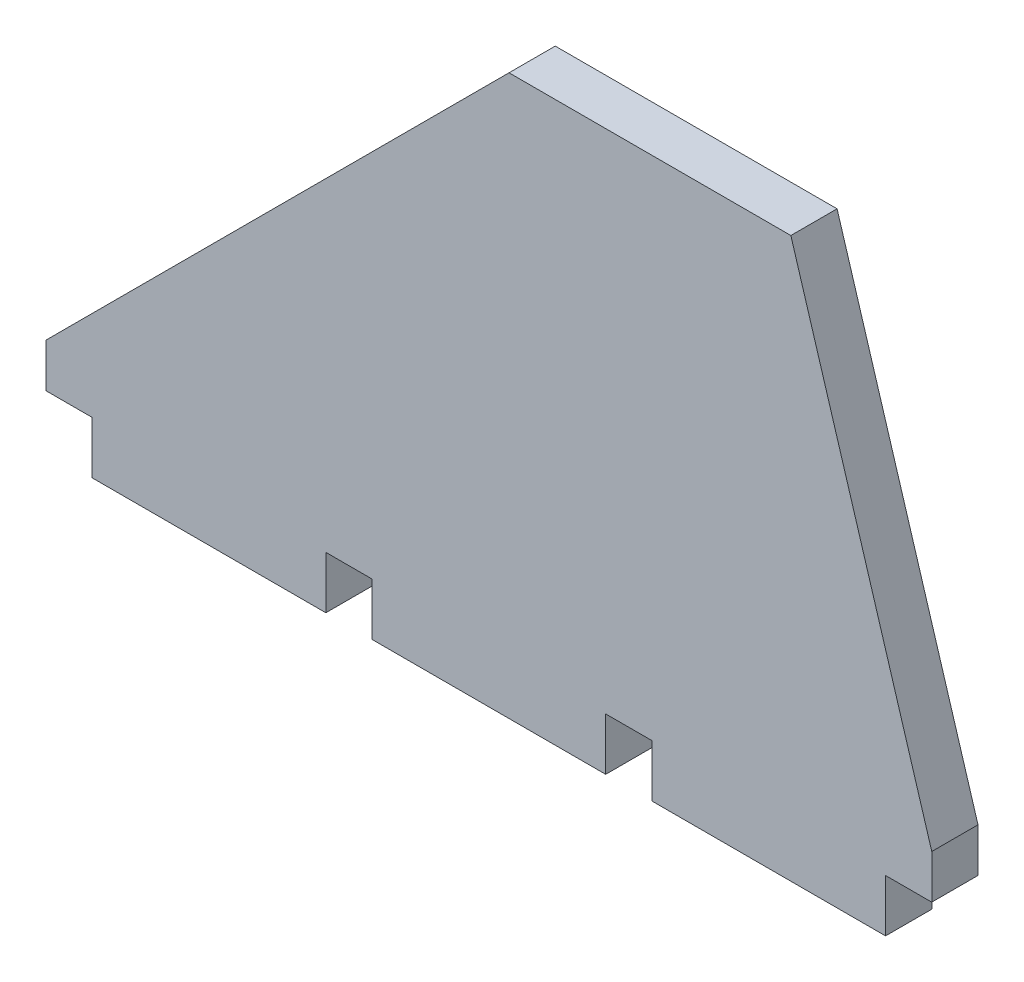
ISO-10303-21;
HEADER;
FILE_DESCRIPTION(('STEP AP214'),'2;1');
FILE_NAME('part.step','',(''),(''),'','','');
FILE_SCHEMA(('AUTOMOTIVE_DESIGN { 1 0 10303 214 1 1 1 1 }'));
ENDSEC;
DATA;
#1=APPLICATION_CONTEXT('core data for automotive mechanical design processes');
#2=APPLICATION_PROTOCOL_DEFINITION('international standard','automotive_design',2000,#1);
#3=PRODUCT_CONTEXT('',#1,'mechanical');
#4=PRODUCT('Part','Part','',(#3));
#5=PRODUCT_RELATED_PRODUCT_CATEGORY('part','',(#4));
#6=PRODUCT_DEFINITION_FORMATION('','',#4);
#7=PRODUCT_DEFINITION_CONTEXT('part definition',#1,'design');
#8=PRODUCT_DEFINITION('design','',#6,#7);
#9=PRODUCT_DEFINITION_SHAPE('','',#8);
#10=(LENGTH_UNIT() NAMED_UNIT(*) SI_UNIT(.MILLI.,.METRE.));
#11=(NAMED_UNIT(*) PLANE_ANGLE_UNIT() SI_UNIT($,.RADIAN.));
#12=(NAMED_UNIT(*) SI_UNIT($,.STERADIAN.) SOLID_ANGLE_UNIT());
#13=UNCERTAINTY_MEASURE_WITH_UNIT(LENGTH_MEASURE(1.E-05),#10,'distance_accuracy_value','');
#14=(GEOMETRIC_REPRESENTATION_CONTEXT(3) GLOBAL_UNCERTAINTY_ASSIGNED_CONTEXT((#13)) GLOBAL_UNIT_ASSIGNED_CONTEXT((#10,
#11,#12)) REPRESENTATION_CONTEXT('',''));
#15=CARTESIAN_POINT('',(0.,0.,0.));
#16=DIRECTION('',(0.,0.,1.));
#17=DIRECTION('',(1.,0.,0.));
#18=AXIS2_PLACEMENT_3D('',#15,#16,#17);
#19=CARTESIAN_POINT('',(0.,10.9,11.482));
#20=DIRECTION('',(1.,0.,0.));
#21=DIRECTION('',(0.,0.,-1.));
#22=AXIS2_PLACEMENT_3D('',#19,#20,#21);
#23=PLANE('',#22);
#24=DIRECTION('',(0.,-1.,0.));
#25=VECTOR('',#24,1.);
#26=CARTESIAN_POINT('',(0.,10.9,0.));
#27=LINE('',#26,#25);
#28=CARTESIAN_POINT('',(0.,10.9,0.));
#29=VERTEX_POINT('',#28);
#30=CARTESIAN_POINT('',(0.,0.,0.));
#31=VERTEX_POINT('',#30);
#32=EDGE_CURVE('E190',#29,#31,#27,.T.);
#33=ORIENTED_EDGE('',*,*,#32,.T.);
#34=DIRECTION('',(0.,0.,-1.));
#35=VECTOR('',#34,1.);
#36=CARTESIAN_POINT('',(0.,0.,11.482));
#37=LINE('',#36,#35);
#38=CARTESIAN_POINT('',(0.,0.,11.482));
#39=VERTEX_POINT('',#38);
#40=EDGE_CURVE('E11',#39,#31,#37,.T.);
#41=ORIENTED_EDGE('',*,*,#40,.F.);
#42=DIRECTION('',(0.,-1.,0.));
#43=VECTOR('',#42,1.);
#44=CARTESIAN_POINT('',(0.,10.9,11.482));
#45=LINE('',#44,#43);
#46=CARTESIAN_POINT('',(0.,10.9,11.482));
#47=VERTEX_POINT('',#46);
#48=EDGE_CURVE('E224',#47,#39,#45,.T.);
#49=ORIENTED_EDGE('',*,*,#48,.F.);
#50=DIRECTION('',(0.,0.,-1.));
#51=VECTOR('',#50,1.);
#52=CARTESIAN_POINT('',(0.,10.9,11.482));
#53=LINE('',#52,#51);
#54=EDGE_CURVE('E186',#47,#29,#53,.T.);
#55=ORIENTED_EDGE('',*,*,#54,.T.);
#56=EDGE_LOOP('',(#33,#41,#49,#55));
#57=FACE_BOUND('',#56,.T.);
#58=ADVANCED_FACE('F34',(#57),#23,.F.);
#59=CARTESIAN_POINT('',(0.,0.,11.482));
#60=DIRECTION('',(0.,1.,0.));
#61=DIRECTION('',(0.,0.,1.));
#62=AXIS2_PLACEMENT_3D('',#59,#60,#61);
#63=PLANE('',#62);
#64=DIRECTION('',(1.,0.,0.));
#65=VECTOR('',#64,1.);
#66=CARTESIAN_POINT('',(0.,0.,0.));
#67=LINE('',#66,#65);
#68=CARTESIAN_POINT('',(11.482,0.,0.));
#69=VERTEX_POINT('',#68);
#70=EDGE_CURVE('E193',#31,#69,#67,.T.);
#71=ORIENTED_EDGE('',*,*,#70,.T.);
#72=DIRECTION('',(0.,0.,-1.));
#73=VECTOR('',#72,1.);
#74=CARTESIAN_POINT('',(11.482,0.,11.482));
#75=LINE('',#74,#73);
#76=CARTESIAN_POINT('',(11.482,0.,11.482));
#77=VERTEX_POINT('',#76);
#78=EDGE_CURVE('E42',#77,#69,#75,.T.);
#79=ORIENTED_EDGE('',*,*,#78,.F.);
#80=DIRECTION('',(1.,0.,0.));
#81=VECTOR('',#80,1.);
#82=CARTESIAN_POINT('',(0.,0.,11.482));
#83=LINE('',#82,#81);
#84=EDGE_CURVE('E123',#39,#77,#83,.T.);
#85=ORIENTED_EDGE('',*,*,#84,.F.);
#86=ORIENTED_EDGE('',*,*,#40,.T.);
#87=EDGE_LOOP('',(#71,#79,#85,#86));
#88=FACE_BOUND('',#87,.T.);
#89=ADVANCED_FACE('F332',(#88),#63,.F.);
#90=CARTESIAN_POINT('',(11.482,0.,11.482));
#91=DIRECTION('',(1.,0.,0.));
#92=DIRECTION('',(0.,0.,-1.));
#93=AXIS2_PLACEMENT_3D('',#90,#91,#92);
#94=PLANE('',#93);
#95=DIRECTION('',(0.,-1.,0.));
#96=VECTOR('',#95,1.);
#97=CARTESIAN_POINT('',(11.482,0.,0.));
#98=LINE('',#97,#96);
#99=CARTESIAN_POINT('',(11.482,-13.,0.));
#100=VERTEX_POINT('',#99);
#101=EDGE_CURVE('E195',#69,#100,#98,.T.);
#102=ORIENTED_EDGE('',*,*,#101,.T.);
#103=DIRECTION('',(0.,0.,-1.));
#104=VECTOR('',#103,1.);
#105=CARTESIAN_POINT('',(11.482,-13.,11.482));
#106=LINE('',#105,#104);
#107=CARTESIAN_POINT('',(11.482,-13.,11.482));
#108=VERTEX_POINT('',#107);
#109=EDGE_CURVE('E261',#108,#100,#106,.T.);
#110=ORIENTED_EDGE('',*,*,#109,.F.);
#111=DIRECTION('',(0.,-1.,0.));
#112=VECTOR('',#111,1.);
#113=CARTESIAN_POINT('',(11.482,0.,11.482));
#114=LINE('',#113,#112);
#115=EDGE_CURVE('E269',#77,#108,#114,.T.);
#116=ORIENTED_EDGE('',*,*,#115,.F.);
#117=ORIENTED_EDGE('',*,*,#78,.T.);
#118=EDGE_LOOP('',(#102,#110,#116,#117));
#119=FACE_BOUND('',#118,.T.);
#120=ADVANCED_FACE('F267',(#119),#94,.F.);
#121=CARTESIAN_POINT('',(11.482,-13.,11.482));
#122=DIRECTION('',(0.,1.,0.));
#123=DIRECTION('',(0.,0.,1.));
#124=AXIS2_PLACEMENT_3D('',#121,#122,#123);
#125=PLANE('',#124);
#126=DIRECTION('',(1.,0.,0.));
#127=VECTOR('',#126,1.);
#128=CARTESIAN_POINT('',(11.482,-13.,0.));
#129=LINE('',#128,#127);
#130=CARTESIAN_POINT('',(69.506,-13.,0.));
#131=VERTEX_POINT('',#130);
#132=EDGE_CURVE('E197',#100,#131,#129,.T.);
#133=ORIENTED_EDGE('',*,*,#132,.T.);
#134=DIRECTION('',(0.,0.,-1.));
#135=VECTOR('',#134,1.);
#136=CARTESIAN_POINT('',(69.506,-13.,11.482));
#137=LINE('',#136,#135);
#138=CARTESIAN_POINT('',(69.506,-13.,11.482));
#139=VERTEX_POINT('',#138);
#140=EDGE_CURVE('E258',#139,#131,#137,.T.);
#141=ORIENTED_EDGE('',*,*,#140,.F.);
#142=DIRECTION('',(1.,0.,0.));
#143=VECTOR('',#142,1.);
#144=CARTESIAN_POINT('',(11.482,-13.,11.482));
#145=LINE('',#144,#143);
#146=EDGE_CURVE('E287',#108,#139,#145,.T.);
#147=ORIENTED_EDGE('',*,*,#146,.F.);
#148=ORIENTED_EDGE('',*,*,#109,.T.);
#149=EDGE_LOOP('',(#133,#141,#147,#148));
#150=FACE_BOUND('',#149,.T.);
#151=ADVANCED_FACE('F278',(#150),#125,.F.);
#152=CARTESIAN_POINT('',(69.506,-13.,11.482));
#153=DIRECTION('',(-1.,0.,0.));
#154=DIRECTION('',(0.,-1.,0.));
#155=AXIS2_PLACEMENT_3D('',#152,#153,#154);
#156=PLANE('',#155);
#157=DIRECTION('',(0.,1.,0.));
#158=VECTOR('',#157,1.);
#159=CARTESIAN_POINT('',(69.506,-13.,0.));
#160=LINE('',#159,#158);
#161=CARTESIAN_POINT('',(69.506,0.,0.));
#162=VERTEX_POINT('',#161);
#163=EDGE_CURVE('E199',#131,#162,#160,.T.);
#164=ORIENTED_EDGE('',*,*,#163,.T.);
#165=DIRECTION('',(0.,0.,-1.));
#166=VECTOR('',#165,1.);
#167=CARTESIAN_POINT('',(69.506,0.,11.482));
#168=LINE('',#167,#166);
#169=CARTESIAN_POINT('',(69.506,0.,11.482));
#170=VERTEX_POINT('',#169);
#171=EDGE_CURVE('E255',#170,#162,#168,.T.);
#172=ORIENTED_EDGE('',*,*,#171,.F.);
#173=DIRECTION('',(0.,1.,0.));
#174=VECTOR('',#173,1.);
#175=CARTESIAN_POINT('',(69.506,-13.,11.482));
#176=LINE('',#175,#174);
#177=EDGE_CURVE('E284',#139,#170,#176,.T.);
#178=ORIENTED_EDGE('',*,*,#177,.F.);
#179=ORIENTED_EDGE('',*,*,#140,.T.);
#180=EDGE_LOOP('',(#164,#172,#178,#179));
#181=FACE_BOUND('',#180,.T.);
#182=ADVANCED_FACE('F282',(#181),#156,.F.);
#183=CARTESIAN_POINT('',(69.506,0.,11.482));
#184=DIRECTION('',(0.,1.,0.));
#185=DIRECTION('',(0.,0.,1.));
#186=AXIS2_PLACEMENT_3D('',#183,#184,#185);
#187=PLANE('',#186);
#188=DIRECTION('',(1.,0.,0.));
#189=VECTOR('',#188,1.);
#190=CARTESIAN_POINT('',(69.506,0.,0.));
#191=LINE('',#190,#189);
#192=CARTESIAN_POINT('',(80.988,0.,0.));
#193=VERTEX_POINT('',#192);
#194=EDGE_CURVE('E201',#162,#193,#191,.T.);
#195=ORIENTED_EDGE('',*,*,#194,.T.);
#196=DIRECTION('',(0.,0.,-1.));
#197=VECTOR('',#196,1.);
#198=CARTESIAN_POINT('',(80.988,0.,11.482));
#199=LINE('',#198,#197);
#200=CARTESIAN_POINT('',(80.988,0.,11.482));
#201=VERTEX_POINT('',#200);
#202=EDGE_CURVE('E252',#201,#193,#199,.T.);
#203=ORIENTED_EDGE('',*,*,#202,.F.);
#204=DIRECTION('',(1.,0.,0.));
#205=VECTOR('',#204,1.);
#206=CARTESIAN_POINT('',(69.506,0.,11.482));
#207=LINE('',#206,#205);
#208=EDGE_CURVE('E286',#170,#201,#207,.T.);
#209=ORIENTED_EDGE('',*,*,#208,.F.);
#210=ORIENTED_EDGE('',*,*,#171,.T.);
#211=EDGE_LOOP('',(#195,#203,#209,#210));
#212=FACE_BOUND('',#211,.T.);
#213=ADVANCED_FACE('F345',(#212),#187,.F.);
#214=CARTESIAN_POINT('',(80.988,0.,11.482));
#215=DIRECTION('',(1.,0.,0.));
#216=DIRECTION('',(0.,1.,0.));
#217=AXIS2_PLACEMENT_3D('',#214,#215,#216);
#218=PLANE('',#217);
#219=DIRECTION('',(0.,-1.,0.));
#220=VECTOR('',#219,1.);
#221=CARTESIAN_POINT('',(80.988,0.,0.));
#222=LINE('',#221,#220);
#223=CARTESIAN_POINT('',(80.988,-13.,0.));
#224=VERTEX_POINT('',#223);
#225=EDGE_CURVE('E203',#193,#224,#222,.T.);
#226=ORIENTED_EDGE('',*,*,#225,.T.);
#227=DIRECTION('',(0.,0.,-1.));
#228=VECTOR('',#227,1.);
#229=CARTESIAN_POINT('',(80.988,-13.,11.482));
#230=LINE('',#229,#228);
#231=CARTESIAN_POINT('',(80.988,-13.,11.482));
#232=VERTEX_POINT('',#231);
#233=EDGE_CURVE('E249',#232,#224,#230,.T.);
#234=ORIENTED_EDGE('',*,*,#233,.F.);
#235=DIRECTION('',(0.,-1.,0.));
#236=VECTOR('',#235,1.);
#237=CARTESIAN_POINT('',(80.988,0.,11.482));
#238=LINE('',#237,#236);
#239=EDGE_CURVE('E289',#201,#232,#238,.T.);
#240=ORIENTED_EDGE('',*,*,#239,.F.);
#241=ORIENTED_EDGE('',*,*,#202,.T.);
#242=EDGE_LOOP('',(#226,#234,#240,#241));
#243=FACE_BOUND('',#242,.T.);
#244=ADVANCED_FACE('F348',(#243),#218,.F.);
#245=CARTESIAN_POINT('',(80.988,-13.,11.482));
#246=DIRECTION('',(0.,1.,0.));
#247=DIRECTION('',(-1.,0.,0.));
#248=AXIS2_PLACEMENT_3D('',#245,#246,#247);
#249=PLANE('',#248);
#250=DIRECTION('',(1.,0.,0.));
#251=VECTOR('',#250,1.);
#252=CARTESIAN_POINT('',(80.988,-13.,0.));
#253=LINE('',#252,#251);
#254=CARTESIAN_POINT('',(139.012,-13.,0.));
#255=VERTEX_POINT('',#254);
#256=EDGE_CURVE('E205',#224,#255,#253,.T.);
#257=ORIENTED_EDGE('',*,*,#256,.T.);
#258=DIRECTION('',(0.,0.,-1.));
#259=VECTOR('',#258,1.);
#260=CARTESIAN_POINT('',(139.012,-13.,11.482));
#261=LINE('',#260,#259);
#262=CARTESIAN_POINT('',(139.012,-13.,11.482));
#263=VERTEX_POINT('',#262);
#264=EDGE_CURVE('E246',#263,#255,#261,.T.);
#265=ORIENTED_EDGE('',*,*,#264,.F.);
#266=DIRECTION('',(1.,0.,0.));
#267=VECTOR('',#266,1.);
#268=CARTESIAN_POINT('',(80.988,-13.,11.482));
#269=LINE('',#268,#267);
#270=EDGE_CURVE('E295',#232,#263,#269,.T.);
#271=ORIENTED_EDGE('',*,*,#270,.F.);
#272=ORIENTED_EDGE('',*,*,#233,.T.);
#273=EDGE_LOOP('',(#257,#265,#271,#272));
#274=FACE_BOUND('',#273,.T.);
#275=ADVANCED_FACE('F352',(#274),#249,.F.);
#276=CARTESIAN_POINT('',(139.012,-13.,11.482));
#277=DIRECTION('',(-1.,0.,0.));
#278=DIRECTION('',(0.,-1.,0.));
#279=AXIS2_PLACEMENT_3D('',#276,#277,#278);
#280=PLANE('',#279);
#281=DIRECTION('',(0.,1.,0.));
#282=VECTOR('',#281,1.);
#283=CARTESIAN_POINT('',(139.012,-13.,0.));
#284=LINE('',#283,#282);
#285=CARTESIAN_POINT('',(139.012,0.,0.));
#286=VERTEX_POINT('',#285);
#287=EDGE_CURVE('E207',#255,#286,#284,.T.);
#288=ORIENTED_EDGE('',*,*,#287,.T.);
#289=DIRECTION('',(0.,0.,-1.));
#290=VECTOR('',#289,1.);
#291=CARTESIAN_POINT('',(139.012,0.,11.482));
#292=LINE('',#291,#290);
#293=CARTESIAN_POINT('',(139.012,0.,11.482));
#294=VERTEX_POINT('',#293);
#295=EDGE_CURVE('E243',#294,#286,#292,.T.);
#296=ORIENTED_EDGE('',*,*,#295,.F.);
#297=DIRECTION('',(0.,1.,0.));
#298=VECTOR('',#297,1.);
#299=CARTESIAN_POINT('',(139.012,-13.,11.482));
#300=LINE('',#299,#298);
#301=EDGE_CURVE('E297',#263,#294,#300,.T.);
#302=ORIENTED_EDGE('',*,*,#301,.F.);
#303=ORIENTED_EDGE('',*,*,#264,.T.);
#304=EDGE_LOOP('',(#288,#296,#302,#303));
#305=FACE_BOUND('',#304,.T.);
#306=ADVANCED_FACE('F356',(#305),#280,.F.);
#307=CARTESIAN_POINT('',(139.012,0.,11.482));
#308=DIRECTION('',(0.,1.,0.));
#309=DIRECTION('',(0.,0.,1.));
#310=AXIS2_PLACEMENT_3D('',#307,#308,#309);
#311=PLANE('',#310);
#312=DIRECTION('',(1.,0.,0.));
#313=VECTOR('',#312,1.);
#314=CARTESIAN_POINT('',(139.012,0.,0.));
#315=LINE('',#314,#313);
#316=CARTESIAN_POINT('',(150.494,0.,0.));
#317=VERTEX_POINT('',#316);
#318=EDGE_CURVE('E209',#286,#317,#315,.T.);
#319=ORIENTED_EDGE('',*,*,#318,.T.);
#320=DIRECTION('',(0.,0.,-1.));
#321=VECTOR('',#320,1.);
#322=CARTESIAN_POINT('',(150.494,0.,11.482));
#323=LINE('',#322,#321);
#324=CARTESIAN_POINT('',(150.494,0.,11.482));
#325=VERTEX_POINT('',#324);
#326=EDGE_CURVE('E240',#325,#317,#323,.T.);
#327=ORIENTED_EDGE('',*,*,#326,.F.);
#328=DIRECTION('',(1.,0.,0.));
#329=VECTOR('',#328,1.);
#330=CARTESIAN_POINT('',(139.012,0.,11.482));
#331=LINE('',#330,#329);
#332=EDGE_CURVE('E299',#294,#325,#331,.T.);
#333=ORIENTED_EDGE('',*,*,#332,.F.);
#334=ORIENTED_EDGE('',*,*,#295,.T.);
#335=EDGE_LOOP('',(#319,#327,#333,#334));
#336=FACE_BOUND('',#335,.T.);
#337=ADVANCED_FACE('F360',(#336),#311,.F.);
#338=CARTESIAN_POINT('',(150.494,0.,11.482));
#339=DIRECTION('',(1.,0.,0.));
#340=DIRECTION('',(0.,0.,-1.));
#341=AXIS2_PLACEMENT_3D('',#338,#339,#340);
#342=PLANE('',#341);
#343=DIRECTION('',(0.,-1.,0.));
#344=VECTOR('',#343,1.);
#345=CARTESIAN_POINT('',(150.494,0.,0.));
#346=LINE('',#345,#344);
#347=CARTESIAN_POINT('',(150.494,-13.,0.));
#348=VERTEX_POINT('',#347);
#349=EDGE_CURVE('E211',#317,#348,#346,.T.);
#350=ORIENTED_EDGE('',*,*,#349,.T.);
#351=DIRECTION('',(0.,0.,-1.));
#352=VECTOR('',#351,1.);
#353=CARTESIAN_POINT('',(150.494,-13.,11.482));
#354=LINE('',#353,#352);
#355=CARTESIAN_POINT('',(150.494,-13.,11.482));
#356=VERTEX_POINT('',#355);
#357=EDGE_CURVE('E237',#356,#348,#354,.T.);
#358=ORIENTED_EDGE('',*,*,#357,.F.);
#359=DIRECTION('',(0.,-1.,0.));
#360=VECTOR('',#359,1.);
#361=CARTESIAN_POINT('',(150.494,0.,11.482));
#362=LINE('',#361,#360);
#363=EDGE_CURVE('E301',#325,#356,#362,.T.);
#364=ORIENTED_EDGE('',*,*,#363,.F.);
#365=ORIENTED_EDGE('',*,*,#326,.T.);
#366=EDGE_LOOP('',(#350,#358,#364,#365));
#367=FACE_BOUND('',#366,.T.);
#368=ADVANCED_FACE('F364',(#367),#342,.F.);
#369=CARTESIAN_POINT('',(150.494,-13.,11.482));
#370=DIRECTION('',(0.,1.,0.));
#371=DIRECTION('',(0.,0.,1.));
#372=AXIS2_PLACEMENT_3D('',#369,#370,#371);
#373=PLANE('',#372);
#374=DIRECTION('',(1.,0.,0.));
#375=VECTOR('',#374,1.);
#376=CARTESIAN_POINT('',(150.494,-13.,0.));
#377=LINE('',#376,#375);
#378=CARTESIAN_POINT('',(208.518,-13.,0.));
#379=VERTEX_POINT('',#378);
#380=EDGE_CURVE('E213',#348,#379,#377,.T.);
#381=ORIENTED_EDGE('',*,*,#380,.T.);
#382=DIRECTION('',(0.,0.,-1.));
#383=VECTOR('',#382,1.);
#384=CARTESIAN_POINT('',(208.518,-13.,11.482));
#385=LINE('',#384,#383);
#386=CARTESIAN_POINT('',(208.518,-13.,11.482));
#387=VERTEX_POINT('',#386);
#388=EDGE_CURVE('E234',#387,#379,#385,.T.);
#389=ORIENTED_EDGE('',*,*,#388,.F.);
#390=DIRECTION('',(1.,0.,0.));
#391=VECTOR('',#390,1.);
#392=CARTESIAN_POINT('',(150.494,-13.,11.482));
#393=LINE('',#392,#391);
#394=EDGE_CURVE('E303',#356,#387,#393,.T.);
#395=ORIENTED_EDGE('',*,*,#394,.F.);
#396=ORIENTED_EDGE('',*,*,#357,.T.);
#397=EDGE_LOOP('',(#381,#389,#395,#396));
#398=FACE_BOUND('',#397,.T.);
#399=ADVANCED_FACE('F368',(#398),#373,.F.);
#400=CARTESIAN_POINT('',(208.518,-13.,11.482));
#401=DIRECTION('',(-1.,0.,0.));
#402=DIRECTION('',(0.,0.,1.));
#403=AXIS2_PLACEMENT_3D('',#400,#401,#402);
#404=PLANE('',#403);
#405=DIRECTION('',(0.,1.,0.));
#406=VECTOR('',#405,1.);
#407=CARTESIAN_POINT('',(208.518,-13.,0.));
#408=LINE('',#407,#406);
#409=CARTESIAN_POINT('',(208.518,0.,0.));
#410=VERTEX_POINT('',#409);
#411=EDGE_CURVE('E215',#379,#410,#408,.T.);
#412=ORIENTED_EDGE('',*,*,#411,.T.);
#413=DIRECTION('',(0.,0.,-1.));
#414=VECTOR('',#413,1.);
#415=CARTESIAN_POINT('',(208.518,0.,11.482));
#416=LINE('',#415,#414);
#417=CARTESIAN_POINT('',(208.518,0.,11.482));
#418=VERTEX_POINT('',#417);
#419=EDGE_CURVE('E231',#418,#410,#416,.T.);
#420=ORIENTED_EDGE('',*,*,#419,.F.);
#421=DIRECTION('',(0.,1.,0.));
#422=VECTOR('',#421,1.);
#423=CARTESIAN_POINT('',(208.518,-13.,11.482));
#424=LINE('',#423,#422);
#425=EDGE_CURVE('E305',#387,#418,#424,.T.);
#426=ORIENTED_EDGE('',*,*,#425,.F.);
#427=ORIENTED_EDGE('',*,*,#388,.T.);
#428=EDGE_LOOP('',(#412,#420,#426,#427));
#429=FACE_BOUND('',#428,.T.);
#430=ADVANCED_FACE('F372',(#429),#404,.F.);
#431=CARTESIAN_POINT('',(208.518,0.,11.482));
#432=DIRECTION('',(0.,1.,0.));
#433=DIRECTION('',(0.,0.,1.));
#434=AXIS2_PLACEMENT_3D('',#431,#432,#433);
#435=PLANE('',#434);
#436=DIRECTION('',(1.,0.,0.));
#437=VECTOR('',#436,1.);
#438=CARTESIAN_POINT('',(208.518,0.,0.));
#439=LINE('',#438,#437);
#440=CARTESIAN_POINT('',(220.,0.,0.));
#441=VERTEX_POINT('',#440);
#442=EDGE_CURVE('E217',#410,#441,#439,.T.);
#443=ORIENTED_EDGE('',*,*,#442,.T.);
#444=DIRECTION('',(0.,0.,-1.));
#445=VECTOR('',#444,1.);
#446=CARTESIAN_POINT('',(220.,0.,11.482));
#447=LINE('',#446,#445);
#448=CARTESIAN_POINT('',(220.,0.,11.482));
#449=VERTEX_POINT('',#448);
#450=EDGE_CURVE('E228',#449,#441,#447,.T.);
#451=ORIENTED_EDGE('',*,*,#450,.F.);
#452=DIRECTION('',(1.,0.,0.));
#453=VECTOR('',#452,1.);
#454=CARTESIAN_POINT('',(208.518,0.,11.482));
#455=LINE('',#454,#453);
#456=EDGE_CURVE('E307',#418,#449,#455,.T.);
#457=ORIENTED_EDGE('',*,*,#456,.F.);
#458=ORIENTED_EDGE('',*,*,#419,.T.);
#459=EDGE_LOOP('',(#443,#451,#457,#458));
#460=FACE_BOUND('',#459,.T.);
#461=ADVANCED_FACE('F313',(#460),#435,.F.);
#462=CARTESIAN_POINT('',(220.,0.,11.482));
#463=DIRECTION('',(-1.,0.,0.));
#464=DIRECTION('',(0.,-1.,0.));
#465=AXIS2_PLACEMENT_3D('',#462,#463,#464);
#466=PLANE('',#465);
#467=DIRECTION('',(0.,1.,0.));
#468=VECTOR('',#467,1.);
#469=CARTESIAN_POINT('',(220.,0.,0.));
#470=LINE('',#469,#468);
#471=CARTESIAN_POINT('',(220.,10.9,0.));
#472=VERTEX_POINT('',#471);
#473=EDGE_CURVE('E219',#441,#472,#470,.T.);
#474=ORIENTED_EDGE('',*,*,#473,.T.);
#475=DIRECTION('',(0.,0.,-1.));
#476=VECTOR('',#475,1.);
#477=CARTESIAN_POINT('',(220.,10.9,11.482));
#478=LINE('',#477,#476);
#479=CARTESIAN_POINT('',(220.,10.9,11.482));
#480=VERTEX_POINT('',#479);
#481=EDGE_CURVE('E181',#480,#472,#478,.T.);
#482=ORIENTED_EDGE('',*,*,#481,.F.);
#483=DIRECTION('',(0.,1.,0.));
#484=VECTOR('',#483,1.);
#485=CARTESIAN_POINT('',(220.,0.,11.482));
#486=LINE('',#485,#484);
#487=EDGE_CURVE('E172',#449,#480,#486,.T.);
#488=ORIENTED_EDGE('',*,*,#487,.F.);
#489=ORIENTED_EDGE('',*,*,#450,.T.);
#490=EDGE_LOOP('',(#474,#482,#488,#489));
#491=FACE_BOUND('',#490,.T.);
#492=ADVANCED_FACE('F317',(#491),#466,.F.);
#493=CARTESIAN_POINT('',(220.,10.9,11.482));
#494=DIRECTION('',(-0.956673880428861,-0.291161615782687,0.));
#495=DIRECTION('',(0.291161615782687,-0.956673880428861,0.));
#496=AXIS2_PLACEMENT_3D('',#493,#494,#495);
#497=PLANE('',#496);
#498=DIRECTION('',(-0.291161615782687,0.956673880428861,0.));
#499=VECTOR('',#498,1.);
#500=CARTESIAN_POINT('',(220.,10.9,0.));
#501=LINE('',#500,#499);
#502=CARTESIAN_POINT('',(185.000000000001,125.9,0.));
#503=VERTEX_POINT('',#502);
#504=EDGE_CURVE('E180',#472,#503,#501,.T.);
#505=ORIENTED_EDGE('',*,*,#504,.T.);
#506=DIRECTION('',(0.,0.,-1.));
#507=VECTOR('',#506,1.);
#508=CARTESIAN_POINT('',(185.000000000001,125.9,11.482));
#509=LINE('',#508,#507);
#510=CARTESIAN_POINT('',(185.000000000001,125.9,11.482));
#511=VERTEX_POINT('',#510);
#512=EDGE_CURVE('E177',#511,#503,#509,.T.);
#513=ORIENTED_EDGE('',*,*,#512,.F.);
#514=DIRECTION('',(-0.291161615782687,0.956673880428861,0.));
#515=VECTOR('',#514,1.);
#516=CARTESIAN_POINT('',(220.,10.9,11.482));
#517=LINE('',#516,#515);
#518=EDGE_CURVE('E166',#480,#511,#517,.T.);
#519=ORIENTED_EDGE('',*,*,#518,.F.);
#520=ORIENTED_EDGE('',*,*,#481,.T.);
#521=EDGE_LOOP('',(#505,#513,#519,#520));
#522=FACE_BOUND('',#521,.T.);
#523=ADVANCED_FACE('F178',(#522),#497,.F.);
#524=CARTESIAN_POINT('',(185.000000000001,125.9,11.482));
#525=DIRECTION('',(0.,-1.,0.));
#526=DIRECTION('',(1.,0.,0.));
#527=AXIS2_PLACEMENT_3D('',#524,#525,#526);
#528=PLANE('',#527);
#529=DIRECTION('',(-1.,0.,0.));
#530=VECTOR('',#529,1.);
#531=CARTESIAN_POINT('',(185.000000000001,125.9,0.));
#532=LINE('',#531,#530);
#533=CARTESIAN_POINT('',(115.000000000001,125.9,0.));
#534=VERTEX_POINT('',#533);
#535=EDGE_CURVE('E109',#503,#534,#532,.T.);
#536=ORIENTED_EDGE('',*,*,#535,.T.);
#537=DIRECTION('',(0.,0.,-1.));
#538=VECTOR('',#537,1.);
#539=CARTESIAN_POINT('',(115.000000000001,125.9,11.482));
#540=LINE('',#539,#538);
#541=CARTESIAN_POINT('',(115.000000000001,125.9,11.482));
#542=VERTEX_POINT('',#541);
#543=EDGE_CURVE('E182',#542,#534,#540,.T.);
#544=ORIENTED_EDGE('',*,*,#543,.F.);
#545=DIRECTION('',(-1.,0.,0.));
#546=VECTOR('',#545,1.);
#547=CARTESIAN_POINT('',(185.000000000001,125.9,11.482));
#548=LINE('',#547,#546);
#549=EDGE_CURVE('E170',#511,#542,#548,.T.);
#550=ORIENTED_EDGE('',*,*,#549,.F.);
#551=ORIENTED_EDGE('',*,*,#512,.T.);
#552=EDGE_LOOP('',(#536,#544,#550,#551));
#553=FACE_BOUND('',#552,.T.);
#554=ADVANCED_FACE('F184',(#553),#528,.F.);
#555=CARTESIAN_POINT('',(115.000000000001,125.9,11.482));
#556=DIRECTION('',(0.707106781186544,-0.707106781186551,0.));
#557=DIRECTION('',(0.707106781186551,0.707106781186544,0.));
#558=AXIS2_PLACEMENT_3D('',#555,#556,#557);
#559=PLANE('',#558);
#560=DIRECTION('',(-0.707106781186551,-0.707106781186544,0.));
#561=VECTOR('',#560,1.);
#562=CARTESIAN_POINT('',(115.000000000001,125.9,0.));
#563=LINE('',#562,#561);
#564=EDGE_CURVE('E115',#534,#29,#563,.T.);
#565=ORIENTED_EDGE('',*,*,#564,.T.);
#566=ORIENTED_EDGE('',*,*,#54,.F.);
#567=DIRECTION('',(-0.707106781186551,-0.707106781186544,0.));
#568=VECTOR('',#567,1.);
#569=CARTESIAN_POINT('',(115.000000000001,125.9,11.482));
#570=LINE('',#569,#568);
#571=EDGE_CURVE('E50',#542,#47,#570,.T.);
#572=ORIENTED_EDGE('',*,*,#571,.F.);
#573=ORIENTED_EDGE('',*,*,#543,.T.);
#574=EDGE_LOOP('',(#565,#566,#572,#573));
#575=FACE_BOUND('',#574,.T.);
#576=ADVANCED_FACE('F321',(#575),#559,.F.);
#577=CARTESIAN_POINT('',(0.,0.,11.482));
#578=DIRECTION('',(0.,0.,1.));
#579=DIRECTION('',(1.,0.,0.));
#580=AXIS2_PLACEMENT_3D('',#577,#578,#579);
#581=PLANE('',#580);
#582=ORIENTED_EDGE('',*,*,#48,.T.);
#583=ORIENTED_EDGE('',*,*,#84,.T.);
#584=ORIENTED_EDGE('',*,*,#115,.T.);
#585=ORIENTED_EDGE('',*,*,#146,.T.);
#586=ORIENTED_EDGE('',*,*,#177,.T.);
#587=ORIENTED_EDGE('',*,*,#208,.T.);
#588=ORIENTED_EDGE('',*,*,#239,.T.);
#589=ORIENTED_EDGE('',*,*,#270,.T.);
#590=ORIENTED_EDGE('',*,*,#301,.T.);
#591=ORIENTED_EDGE('',*,*,#332,.T.);
#592=ORIENTED_EDGE('',*,*,#363,.T.);
#593=ORIENTED_EDGE('',*,*,#394,.T.);
#594=ORIENTED_EDGE('',*,*,#425,.T.);
#595=ORIENTED_EDGE('',*,*,#456,.T.);
#596=ORIENTED_EDGE('',*,*,#487,.T.);
#597=ORIENTED_EDGE('',*,*,#518,.T.);
#598=ORIENTED_EDGE('',*,*,#549,.T.);
#599=ORIENTED_EDGE('',*,*,#571,.T.);
#600=EDGE_LOOP('',(#582,#583,#584,#585,#586,#587,#588,#589,#590,#591,#592,#593,#594,#595,#596,
#597,#598,#599));
#601=FACE_BOUND('',#600,.T.);
#602=ADVANCED_FACE('F168',(#601),#581,.T.);
#603=CARTESIAN_POINT('',(0.,0.,0.));
#604=DIRECTION('',(0.,0.,1.));
#605=DIRECTION('',(1.,0.,0.));
#606=AXIS2_PLACEMENT_3D('',#603,#604,#605);
#607=PLANE('',#606);
#608=ORIENTED_EDGE('',*,*,#32,.F.);
#609=ORIENTED_EDGE('',*,*,#564,.F.);
#610=ORIENTED_EDGE('',*,*,#535,.F.);
#611=ORIENTED_EDGE('',*,*,#504,.F.);
#612=ORIENTED_EDGE('',*,*,#473,.F.);
#613=ORIENTED_EDGE('',*,*,#442,.F.);
#614=ORIENTED_EDGE('',*,*,#411,.F.);
#615=ORIENTED_EDGE('',*,*,#380,.F.);
#616=ORIENTED_EDGE('',*,*,#349,.F.);
#617=ORIENTED_EDGE('',*,*,#318,.F.);
#618=ORIENTED_EDGE('',*,*,#287,.F.);
#619=ORIENTED_EDGE('',*,*,#256,.F.);
#620=ORIENTED_EDGE('',*,*,#225,.F.);
#621=ORIENTED_EDGE('',*,*,#194,.F.);
#622=ORIENTED_EDGE('',*,*,#163,.F.);
#623=ORIENTED_EDGE('',*,*,#132,.F.);
#624=ORIENTED_EDGE('',*,*,#101,.F.);
#625=ORIENTED_EDGE('',*,*,#70,.F.);
#626=EDGE_LOOP('',(#608,#609,#610,#611,#612,#613,#614,#615,#616,#617,#618,#619,#620,#621,#622,
#623,#624,#625));
#627=FACE_BOUND('',#626,.T.);
#628=ADVANCED_FACE('F273',(#627),#607,.F.);
#629=CLOSED_SHELL('',(#58,#89,#120,#151,#182,#213,#244,#275,#306,#337,#368,#399,#430,#461,#492,
#523,#554,#576,#602,#628));
#630=MANIFOLD_SOLID_BREP('B2',#629);
#631=ADVANCED_BREP_SHAPE_REPRESENTATION('',(#18,#630),#14);
#632=SHAPE_DEFINITION_REPRESENTATION(#9,#631);
ENDSEC;
END-ISO-10303-21;
